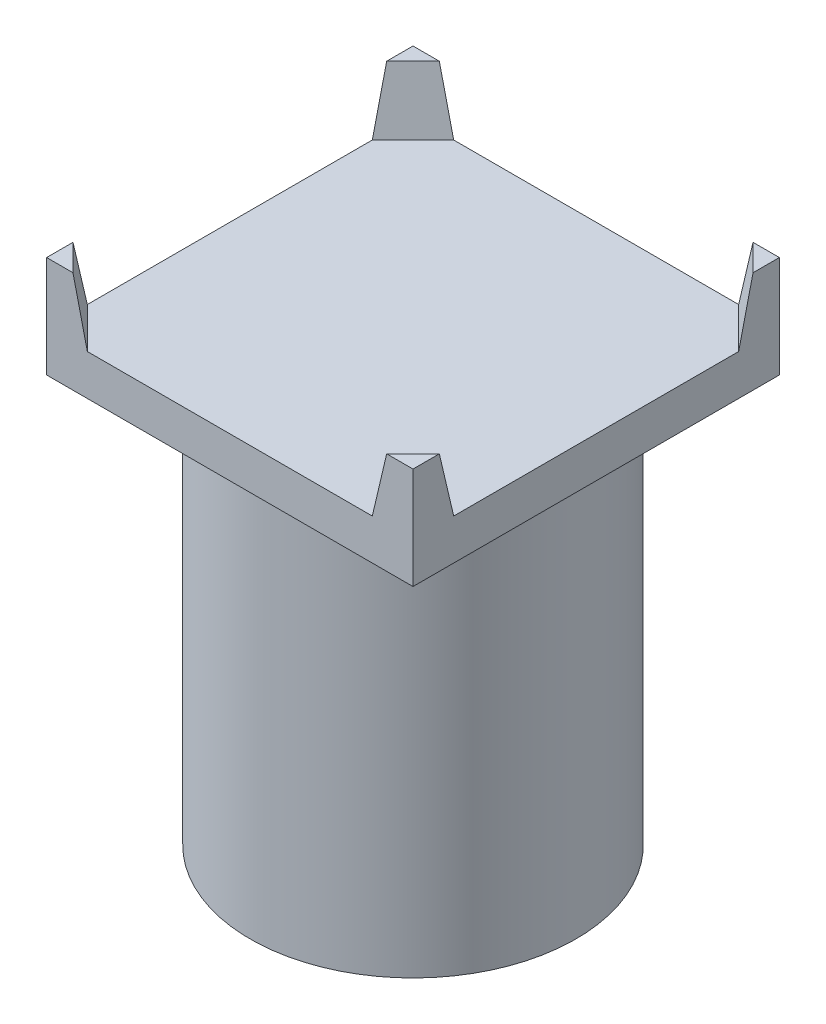
ISO-10303-21;
HEADER;
FILE_DESCRIPTION(('STEP AP214'),'2;1');
FILE_NAME('part.step','',(''),(''),'','','');
FILE_SCHEMA(('AUTOMOTIVE_DESIGN { 1 0 10303 214 1 1 1 1 }'));
ENDSEC;
DATA;
#1=APPLICATION_CONTEXT('core data for automotive mechanical design processes');
#2=APPLICATION_PROTOCOL_DEFINITION('international standard','automotive_design',2000,#1);
#3=PRODUCT_CONTEXT('',#1,'mechanical');
#4=PRODUCT('Part','Part','',(#3));
#5=PRODUCT_RELATED_PRODUCT_CATEGORY('part','',(#4));
#6=PRODUCT_DEFINITION_FORMATION('','',#4);
#7=PRODUCT_DEFINITION_CONTEXT('part definition',#1,'design');
#8=PRODUCT_DEFINITION('design','',#6,#7);
#9=PRODUCT_DEFINITION_SHAPE('','',#8);
#10=(LENGTH_UNIT() NAMED_UNIT(*) SI_UNIT(.MILLI.,.METRE.));
#11=(NAMED_UNIT(*) PLANE_ANGLE_UNIT() SI_UNIT($,.RADIAN.));
#12=(NAMED_UNIT(*) SI_UNIT($,.STERADIAN.) SOLID_ANGLE_UNIT());
#13=UNCERTAINTY_MEASURE_WITH_UNIT(LENGTH_MEASURE(1.E-05),#10,'distance_accuracy_value','');
#14=(GEOMETRIC_REPRESENTATION_CONTEXT(3) GLOBAL_UNCERTAINTY_ASSIGNED_CONTEXT((#13)) GLOBAL_UNIT_ASSIGNED_CONTEXT((#10,
#11,#12)) REPRESENTATION_CONTEXT('',''));
#15=CARTESIAN_POINT('',(0.,0.,0.));
#16=DIRECTION('',(0.,0.,1.));
#17=DIRECTION('',(1.,0.,0.));
#18=AXIS2_PLACEMENT_3D('',#15,#16,#17);
#19=CARTESIAN_POINT('',(-9.,2.,9.));
#20=DIRECTION('',(0.,0.,-1.));
#21=DIRECTION('',(-1.,0.,0.));
#22=AXIS2_PLACEMENT_3D('',#19,#20,#21);
#23=PLANE('',#22);
#24=DIRECTION('',(0.229415733870562,-0.973328526784575,0.));
#25=VECTOR('',#24,1.);
#26=CARTESIAN_POINT('',(-7.10526315789475,2.44659375653887,9.));
#27=LINE('',#26,#25);
#28=CARTESIAN_POINT('',(-7.70710678118655,5.,9.));
#29=VERTEX_POINT('',#28);
#30=CARTESIAN_POINT('',(-7.,2.,9.));
#31=VERTEX_POINT('',#30);
#32=EDGE_CURVE('E151',#29,#31,#27,.T.);
#33=ORIENTED_EDGE('',*,*,#32,.F.);
#34=DIRECTION('',(1.,0.,0.));
#35=VECTOR('',#34,1.);
#36=CARTESIAN_POINT('',(-9.,5.,9.));
#37=LINE('',#36,#35);
#38=CARTESIAN_POINT('',(-9.,5.,9.));
#39=VERTEX_POINT('',#38);
#40=EDGE_CURVE('E182',#39,#29,#37,.T.);
#41=ORIENTED_EDGE('',*,*,#40,.F.);
#42=DIRECTION('',(0.,-1.,0.));
#43=VECTOR('',#42,1.);
#44=CARTESIAN_POINT('',(-9.,2.,9.));
#45=LINE('',#44,#43);
#46=CARTESIAN_POINT('',(-9.,0.,9.));
#47=VERTEX_POINT('',#46);
#48=EDGE_CURVE('E186',#39,#47,#45,.T.);
#49=ORIENTED_EDGE('',*,*,#48,.T.);
#50=DIRECTION('',(1.,0.,0.));
#51=VECTOR('',#50,1.);
#52=CARTESIAN_POINT('',(-9.,0.,9.));
#53=LINE('',#52,#51);
#54=CARTESIAN_POINT('',(9.,0.,9.));
#55=VERTEX_POINT('',#54);
#56=EDGE_CURVE('E184',#47,#55,#53,.T.);
#57=ORIENTED_EDGE('',*,*,#56,.T.);
#58=DIRECTION('',(0.,-1.,0.));
#59=VECTOR('',#58,1.);
#60=CARTESIAN_POINT('',(9.,2.,9.));
#61=LINE('',#60,#59);
#62=CARTESIAN_POINT('',(9.,5.,9.));
#63=VERTEX_POINT('',#62);
#64=EDGE_CURVE('E175',#63,#55,#61,.T.);
#65=ORIENTED_EDGE('',*,*,#64,.F.);
#66=DIRECTION('',(1.,0.,0.));
#67=VECTOR('',#66,1.);
#68=CARTESIAN_POINT('',(9.,5.,9.));
#69=LINE('',#68,#67);
#70=CARTESIAN_POINT('',(7.70710678118656,5.,9.));
#71=VERTEX_POINT('',#70);
#72=EDGE_CURVE('E197',#71,#63,#69,.T.);
#73=ORIENTED_EDGE('',*,*,#72,.F.);
#74=DIRECTION('',(0.229415733870562,0.973328526784575,0.));
#75=VECTOR('',#74,1.);
#76=CARTESIAN_POINT('',(6.15789473684212,-1.57275005231098,9.));
#77=LINE('',#76,#75);
#78=CARTESIAN_POINT('',(7.,2.,9.));
#79=VERTEX_POINT('',#78);
#80=EDGE_CURVE('E149',#79,#71,#77,.T.);
#81=ORIENTED_EDGE('',*,*,#80,.F.);
#82=DIRECTION('',(1.,0.,0.));
#83=VECTOR('',#82,1.);
#84=CARTESIAN_POINT('',(-9.,2.,9.));
#85=LINE('',#84,#83);
#86=EDGE_CURVE('E142',#31,#79,#85,.T.);
#87=ORIENTED_EDGE('',*,*,#86,.F.);
#88=EDGE_LOOP('',(#33,#41,#49,#57,#65,#73,#81,#87));
#89=FACE_BOUND('',#88,.T.);
#90=ADVANCED_FACE('F32',(#89),#23,.F.);
#91=CARTESIAN_POINT('',(-9.,2.,-9.));
#92=DIRECTION('',(1.,0.,0.));
#93=DIRECTION('',(0.,0.,-1.));
#94=AXIS2_PLACEMENT_3D('',#91,#92,#93);
#95=PLANE('',#94);
#96=DIRECTION('',(0.,0.973328526784575,0.229415733870562));
#97=VECTOR('',#96,1.);
#98=CARTESIAN_POINT('',(-9.,-1.57275005231098,6.15789473684212));
#99=LINE('',#98,#97);
#100=CARTESIAN_POINT('',(-9.00000000000001,2.,7.));
#101=VERTEX_POINT('',#100);
#102=CARTESIAN_POINT('',(-9.,5.,7.70710678118656));
#103=VERTEX_POINT('',#102);
#104=EDGE_CURVE('E47',#101,#103,#99,.T.);
#105=ORIENTED_EDGE('',*,*,#104,.F.);
#106=DIRECTION('',(0.,0.,1.));
#107=VECTOR('',#106,1.);
#108=CARTESIAN_POINT('',(-9.,2.,-9.));
#109=LINE('',#108,#107);
#110=CARTESIAN_POINT('',(-9.00000000000001,2.,-7.));
#111=VERTEX_POINT('',#110);
#112=EDGE_CURVE('E167',#111,#101,#109,.T.);
#113=ORIENTED_EDGE('',*,*,#112,.F.);
#114=DIRECTION('',(0.,-0.973328526784575,0.229415733870562));
#115=VECTOR('',#114,1.);
#116=CARTESIAN_POINT('',(-9.,2.44659375653887,-7.10526315789475));
#117=LINE('',#116,#115);
#118=CARTESIAN_POINT('',(-9.00000000000001,5.,-7.70710678118655));
#119=VERTEX_POINT('',#118);
#120=EDGE_CURVE('E162',#119,#111,#117,.T.);
#121=ORIENTED_EDGE('',*,*,#120,.F.);
#122=DIRECTION('',(0.,0.,1.));
#123=VECTOR('',#122,1.);
#124=CARTESIAN_POINT('',(-9.,5.,-7.));
#125=LINE('',#124,#123);
#126=CARTESIAN_POINT('',(-9.,5.,-9.));
#127=VERTEX_POINT('',#126);
#128=EDGE_CURVE('E169',#127,#119,#125,.T.);
#129=ORIENTED_EDGE('',*,*,#128,.F.);
#130=DIRECTION('',(0.,-1.,0.));
#131=VECTOR('',#130,1.);
#132=CARTESIAN_POINT('',(-9.,2.,-9.));
#133=LINE('',#132,#131);
#134=CARTESIAN_POINT('',(-9.,0.,-9.));
#135=VERTEX_POINT('',#134);
#136=EDGE_CURVE('E183',#127,#135,#133,.T.);
#137=ORIENTED_EDGE('',*,*,#136,.T.);
#138=DIRECTION('',(0.,0.,1.));
#139=VECTOR('',#138,1.);
#140=CARTESIAN_POINT('',(-9.,0.,-9.));
#141=LINE('',#140,#139);
#142=EDGE_CURVE('E180',#135,#47,#141,.T.);
#143=ORIENTED_EDGE('',*,*,#142,.T.);
#144=ORIENTED_EDGE('',*,*,#48,.F.);
#145=DIRECTION('',(0.,0.,1.));
#146=VECTOR('',#145,1.);
#147=CARTESIAN_POINT('',(-9.,5.,7.));
#148=LINE('',#147,#146);
#149=EDGE_CURVE('E189',#103,#39,#148,.T.);
#150=ORIENTED_EDGE('',*,*,#149,.F.);
#151=EDGE_LOOP('',(#105,#113,#121,#129,#137,#143,#144,#150));
#152=FACE_BOUND('',#151,.T.);
#153=ADVANCED_FACE('F34',(#152),#95,.F.);
#154=CARTESIAN_POINT('',(0.,5.,0.));
#155=DIRECTION('',(0.,1.,0.));
#156=DIRECTION('',(0.,0.,1.));
#157=AXIS2_PLACEMENT_3D('',#154,#155,#156);
#158=PLANE('',#157);
#159=ORIENTED_EDGE('',*,*,#40,.T.);
#160=DIRECTION('',(-0.707106781186548,0.,-0.707106781186548));
#161=VECTOR('',#160,1.);
#162=CARTESIAN_POINT('',(-7.70710678118655,5.,9.));
#163=LINE('',#162,#161);
#164=EDGE_CURVE('E208',#29,#103,#163,.T.);
#165=ORIENTED_EDGE('',*,*,#164,.T.);
#166=ORIENTED_EDGE('',*,*,#149,.T.);
#167=EDGE_LOOP('',(#159,#165,#166));
#168=FACE_BOUND('',#167,.T.);
#169=ADVANCED_FACE('F214',(#168),#158,.T.);
#170=CARTESIAN_POINT('',(9.,2.,-9.));
#171=DIRECTION('',(-1.,0.,0.));
#172=DIRECTION('',(0.,0.,1.));
#173=AXIS2_PLACEMENT_3D('',#170,#171,#172);
#174=PLANE('',#173);
#175=DIRECTION('',(0.,-0.973328526784575,-0.229415733870562));
#176=VECTOR('',#175,1.);
#177=CARTESIAN_POINT('',(9.,-1.57275005231098,6.15789473684212));
#178=LINE('',#177,#176);
#179=CARTESIAN_POINT('',(9.00000000000001,5.,7.70710678118655));
#180=VERTEX_POINT('',#179);
#181=CARTESIAN_POINT('',(9.00000000000001,2.,7.));
#182=VERTEX_POINT('',#181);
#183=EDGE_CURVE('E121',#180,#182,#178,.T.);
#184=ORIENTED_EDGE('',*,*,#183,.F.);
#185=DIRECTION('',(0.,0.,-1.));
#186=VECTOR('',#185,1.);
#187=CARTESIAN_POINT('',(9.,5.,7.));
#188=LINE('',#187,#186);
#189=EDGE_CURVE('E174',#63,#180,#188,.T.);
#190=ORIENTED_EDGE('',*,*,#189,.F.);
#191=ORIENTED_EDGE('',*,*,#64,.T.);
#192=DIRECTION('',(0.,0.,-1.));
#193=VECTOR('',#192,1.);
#194=CARTESIAN_POINT('',(9.,0.,-9.));
#195=LINE('',#194,#193);
#196=CARTESIAN_POINT('',(9.,0.,-9.));
#197=VERTEX_POINT('',#196);
#198=EDGE_CURVE('E171',#55,#197,#195,.T.);
#199=ORIENTED_EDGE('',*,*,#198,.T.);
#200=DIRECTION('',(0.,-1.,0.));
#201=VECTOR('',#200,1.);
#202=CARTESIAN_POINT('',(9.,2.,-9.));
#203=LINE('',#202,#201);
#204=CARTESIAN_POINT('',(9.,5.,-9.));
#205=VERTEX_POINT('',#204);
#206=EDGE_CURVE('E179',#205,#197,#203,.T.);
#207=ORIENTED_EDGE('',*,*,#206,.F.);
#208=DIRECTION('',(0.,0.,-1.));
#209=VECTOR('',#208,1.);
#210=CARTESIAN_POINT('',(9.,5.,-7.));
#211=LINE('',#210,#209);
#212=CARTESIAN_POINT('',(9.,5.,-7.70710678118656));
#213=VERTEX_POINT('',#212);
#214=EDGE_CURVE('E203',#213,#205,#211,.T.);
#215=ORIENTED_EDGE('',*,*,#214,.F.);
#216=DIRECTION('',(0.,0.973328526784575,-0.229415733870562));
#217=VECTOR('',#216,1.);
#218=CARTESIAN_POINT('',(9.,2.44659375653887,-7.10526315789475));
#219=LINE('',#218,#217);
#220=CARTESIAN_POINT('',(9.00000000000001,2.,-7.));
#221=VERTEX_POINT('',#220);
#222=EDGE_CURVE('E138',#221,#213,#219,.T.);
#223=ORIENTED_EDGE('',*,*,#222,.F.);
#224=DIRECTION('',(0.,0.,-1.));
#225=VECTOR('',#224,1.);
#226=CARTESIAN_POINT('',(9.,2.,-9.));
#227=LINE('',#226,#225);
#228=EDGE_CURVE('E135',#182,#221,#227,.T.);
#229=ORIENTED_EDGE('',*,*,#228,.F.);
#230=EDGE_LOOP('',(#184,#190,#191,#199,#207,#215,#223,#229));
#231=FACE_BOUND('',#230,.T.);
#232=ADVANCED_FACE('F136',(#231),#174,.F.);
#233=CARTESIAN_POINT('',(0.,5.,0.));
#234=DIRECTION('',(0.,1.,0.));
#235=DIRECTION('',(0.,0.,1.));
#236=AXIS2_PLACEMENT_3D('',#233,#234,#235);
#237=PLANE('',#236);
#238=ORIENTED_EDGE('',*,*,#189,.T.);
#239=DIRECTION('',(0.707106781186548,0.,-0.707106781186548));
#240=VECTOR('',#239,1.);
#241=CARTESIAN_POINT('',(7.70710678118655,5.,9.));
#242=LINE('',#241,#240);
#243=EDGE_CURVE('E128',#71,#180,#242,.T.);
#244=ORIENTED_EDGE('',*,*,#243,.F.);
#245=ORIENTED_EDGE('',*,*,#72,.T.);
#246=EDGE_LOOP('',(#238,#244,#245));
#247=FACE_BOUND('',#246,.T.);
#248=ADVANCED_FACE('F255',(#247),#237,.T.);
#249=CARTESIAN_POINT('',(-9.,2.,-9.));
#250=DIRECTION('',(0.,0.,1.));
#251=DIRECTION('',(1.,0.,0.));
#252=AXIS2_PLACEMENT_3D('',#249,#250,#251);
#253=PLANE('',#252);
#254=DIRECTION('',(-0.229415733870562,-0.973328526784575,0.));
#255=VECTOR('',#254,1.);
#256=CARTESIAN_POINT('',(6.15789473684212,-1.57275005231098,-9.));
#257=LINE('',#256,#255);
#258=CARTESIAN_POINT('',(7.70710678118655,5.,-9.));
#259=VERTEX_POINT('',#258);
#260=CARTESIAN_POINT('',(7.,2.,-9.));
#261=VERTEX_POINT('',#260);
#262=EDGE_CURVE('E159',#259,#261,#257,.T.);
#263=ORIENTED_EDGE('',*,*,#262,.F.);
#264=DIRECTION('',(-1.,0.,0.));
#265=VECTOR('',#264,1.);
#266=CARTESIAN_POINT('',(9.,5.,-9.));
#267=LINE('',#266,#265);
#268=EDGE_CURVE('E178',#205,#259,#267,.T.);
#269=ORIENTED_EDGE('',*,*,#268,.F.);
#270=ORIENTED_EDGE('',*,*,#206,.T.);
#271=DIRECTION('',(-1.,0.,0.));
#272=VECTOR('',#271,1.);
#273=CARTESIAN_POINT('',(-9.,0.,-9.));
#274=LINE('',#273,#272);
#275=EDGE_CURVE('E176',#197,#135,#274,.T.);
#276=ORIENTED_EDGE('',*,*,#275,.T.);
#277=ORIENTED_EDGE('',*,*,#136,.F.);
#278=DIRECTION('',(-1.,0.,0.));
#279=VECTOR('',#278,1.);
#280=CARTESIAN_POINT('',(-9.,5.,-9.));
#281=LINE('',#280,#279);
#282=CARTESIAN_POINT('',(-7.70710678118656,5.,-9.));
#283=VERTEX_POINT('',#282);
#284=EDGE_CURVE('E206',#283,#127,#281,.T.);
#285=ORIENTED_EDGE('',*,*,#284,.F.);
#286=DIRECTION('',(-0.229415733870562,0.973328526784575,0.));
#287=VECTOR('',#286,1.);
#288=CARTESIAN_POINT('',(-7.10526315789475,2.44659375653887,-9.));
#289=LINE('',#288,#287);
#290=CARTESIAN_POINT('',(-7.,2.,-9.));
#291=VERTEX_POINT('',#290);
#292=EDGE_CURVE('E161',#291,#283,#289,.T.);
#293=ORIENTED_EDGE('',*,*,#292,.F.);
#294=DIRECTION('',(-1.,0.,0.));
#295=VECTOR('',#294,1.);
#296=CARTESIAN_POINT('',(-9.,2.,-9.));
#297=LINE('',#296,#295);
#298=EDGE_CURVE('E141',#261,#291,#297,.T.);
#299=ORIENTED_EDGE('',*,*,#298,.F.);
#300=EDGE_LOOP('',(#263,#269,#270,#276,#277,#285,#293,#299));
#301=FACE_BOUND('',#300,.T.);
#302=ADVANCED_FACE('F247',(#301),#253,.F.);
#303=CARTESIAN_POINT('',(0.,5.,0.));
#304=DIRECTION('',(0.,1.,0.));
#305=DIRECTION('',(0.,0.,1.));
#306=AXIS2_PLACEMENT_3D('',#303,#304,#305);
#307=PLANE('',#306);
#308=ORIENTED_EDGE('',*,*,#268,.T.);
#309=DIRECTION('',(0.707106781186548,0.,0.707106781186548));
#310=VECTOR('',#309,1.);
#311=CARTESIAN_POINT('',(7.70710678118655,5.,-9.));
#312=LINE('',#311,#310);
#313=EDGE_CURVE('E200',#259,#213,#312,.T.);
#314=ORIENTED_EDGE('',*,*,#313,.T.);
#315=ORIENTED_EDGE('',*,*,#214,.T.);
#316=EDGE_LOOP('',(#308,#314,#315));
#317=FACE_BOUND('',#316,.T.);
#318=ADVANCED_FACE('F262',(#317),#307,.T.);
#319=CARTESIAN_POINT('',(0.,5.,0.));
#320=DIRECTION('',(0.,-1.,0.));
#321=DIRECTION('',(0.,0.,-1.));
#322=AXIS2_PLACEMENT_3D('',#319,#320,#321);
#323=PLANE('',#322);
#324=DIRECTION('',(-0.707106781186548,0.,0.707106781186548));
#325=VECTOR('',#324,1.);
#326=CARTESIAN_POINT('',(-7.70710678118655,5.,-9.));
#327=LINE('',#326,#325);
#328=EDGE_CURVE('E166',#283,#119,#327,.T.);
#329=ORIENTED_EDGE('',*,*,#328,.F.);
#330=ORIENTED_EDGE('',*,*,#284,.T.);
#331=ORIENTED_EDGE('',*,*,#128,.T.);
#332=EDGE_LOOP('',(#329,#330,#331));
#333=FACE_BOUND('',#332,.T.);
#334=ADVANCED_FACE('F243',(#333),#323,.F.);
#335=CARTESIAN_POINT('',(0.,2.,0.));
#336=DIRECTION('',(0.,1.,0.));
#337=DIRECTION('',(0.,0.,1.));
#338=AXIS2_PLACEMENT_3D('',#335,#336,#337);
#339=PLANE('',#338);
#340=ORIENTED_EDGE('',*,*,#112,.T.);
#341=DIRECTION('',(-0.707106781186548,0.,-0.707106781186548));
#342=VECTOR('',#341,1.);
#343=CARTESIAN_POINT('',(-7.,2.,9.));
#344=LINE('',#343,#342);
#345=EDGE_CURVE('E155',#31,#101,#344,.T.);
#346=ORIENTED_EDGE('',*,*,#345,.F.);
#347=ORIENTED_EDGE('',*,*,#86,.T.);
#348=DIRECTION('',(-0.707106781186548,0.,0.707106781186548));
#349=VECTOR('',#348,1.);
#350=CARTESIAN_POINT('',(7.,2.,9.));
#351=LINE('',#350,#349);
#352=EDGE_CURVE('E125',#182,#79,#351,.T.);
#353=ORIENTED_EDGE('',*,*,#352,.F.);
#354=ORIENTED_EDGE('',*,*,#228,.T.);
#355=DIRECTION('',(0.707106781186548,0.,0.707106781186548));
#356=VECTOR('',#355,1.);
#357=CARTESIAN_POINT('',(7.,2.,-9.));
#358=LINE('',#357,#356);
#359=EDGE_CURVE('E157',#261,#221,#358,.T.);
#360=ORIENTED_EDGE('',*,*,#359,.F.);
#361=ORIENTED_EDGE('',*,*,#298,.T.);
#362=DIRECTION('',(0.707106781186548,0.,-0.707106781186548));
#363=VECTOR('',#362,1.);
#364=CARTESIAN_POINT('',(-7.,2.,-9.));
#365=LINE('',#364,#363);
#366=EDGE_CURVE('E160',#111,#291,#365,.T.);
#367=ORIENTED_EDGE('',*,*,#366,.F.);
#368=EDGE_LOOP('',(#340,#346,#347,#353,#354,#360,#361,#367));
#369=FACE_BOUND('',#368,.T.);
#370=ADVANCED_FACE('F146',(#369),#339,.T.);
#371=CARTESIAN_POINT('',(0.,0.,0.));
#372=DIRECTION('',(0.,1.,0.));
#373=DIRECTION('',(0.,0.,1.));
#374=AXIS2_PLACEMENT_3D('',#371,#372,#373);
#375=PLANE('',#374);
#376=CARTESIAN_POINT('',(0.,0.,0.));
#377=DIRECTION('',(0.,-1.,0.));
#378=DIRECTION('',(0.,0.,-1.));
#379=AXIS2_PLACEMENT_3D('',#376,#377,#378);
#380=CIRCLE('',#379,8.);
#381=CARTESIAN_POINT('',(0.,0.,-8.));
#382=VERTEX_POINT('',#381);
#383=EDGE_CURVE('E11',#382,#382,#380,.T.);
#384=ORIENTED_EDGE('',*,*,#383,.F.);
#385=EDGE_LOOP('',(#384));
#386=FACE_BOUND('',#385,.T.);
#387=ORIENTED_EDGE('',*,*,#198,.F.);
#388=ORIENTED_EDGE('',*,*,#56,.F.);
#389=ORIENTED_EDGE('',*,*,#142,.F.);
#390=ORIENTED_EDGE('',*,*,#275,.F.);
#391=EDGE_LOOP('',(#387,#388,#389,#390));
#392=FACE_BOUND('',#391,.T.);
#393=ADVANCED_FACE('F250',(#386,#392),#375,.F.);
#394=CARTESIAN_POINT('',(-7.55445185475032,-1.78060137821375,-7.55445185475032));
#395=DIRECTION('',(0.697485832462916,0.164398987305358,0.697485832462916));
#396=DIRECTION('',(0.707106781186547,0.,-0.707106781186547));
#397=AXIS2_PLACEMENT_3D('',#394,#395,#396);
#398=PLANE('',#397);
#399=ORIENTED_EDGE('',*,*,#328,.T.);
#400=ORIENTED_EDGE('',*,*,#120,.T.);
#401=ORIENTED_EDGE('',*,*,#366,.T.);
#402=ORIENTED_EDGE('',*,*,#292,.T.);
#403=EDGE_LOOP('',(#399,#400,#401,#402));
#404=FACE_BOUND('',#403,.T.);
#405=ADVANCED_FACE('F236',(#404),#398,.T.);
#406=CARTESIAN_POINT('',(7.55445185475032,-1.78060137821375,-7.55445185475032));
#407=DIRECTION('',(-0.697485832462916,0.164398987305358,0.697485832462916));
#408=DIRECTION('',(-0.707106781186547,0.,-0.707106781186547));
#409=AXIS2_PLACEMENT_3D('',#406,#407,#408);
#410=PLANE('',#409);
#411=ORIENTED_EDGE('',*,*,#313,.F.);
#412=ORIENTED_EDGE('',*,*,#262,.T.);
#413=ORIENTED_EDGE('',*,*,#359,.T.);
#414=ORIENTED_EDGE('',*,*,#222,.T.);
#415=EDGE_LOOP('',(#411,#412,#413,#414));
#416=FACE_BOUND('',#415,.T.);
#417=ADVANCED_FACE('F332',(#416),#410,.T.);
#418=CARTESIAN_POINT('',(7.55445185475032,-1.78060137821375,7.55445185475032));
#419=DIRECTION('',(-0.697485832462916,0.164398987305358,-0.697485832462916));
#420=DIRECTION('',(-0.707106781186547,0.,0.707106781186547));
#421=AXIS2_PLACEMENT_3D('',#418,#419,#420);
#422=PLANE('',#421);
#423=ORIENTED_EDGE('',*,*,#243,.T.);
#424=ORIENTED_EDGE('',*,*,#183,.T.);
#425=ORIENTED_EDGE('',*,*,#352,.T.);
#426=ORIENTED_EDGE('',*,*,#80,.T.);
#427=EDGE_LOOP('',(#423,#424,#425,#426));
#428=FACE_BOUND('',#427,.T.);
#429=ADVANCED_FACE('F123',(#428),#422,.T.);
#430=CARTESIAN_POINT('',(-7.55445185475032,-1.78060137821375,7.55445185475032));
#431=DIRECTION('',(0.697485832462916,0.164398987305358,-0.697485832462916));
#432=DIRECTION('',(0.707106781186547,0.,0.707106781186547));
#433=AXIS2_PLACEMENT_3D('',#430,#431,#432);
#434=PLANE('',#433);
#435=ORIENTED_EDGE('',*,*,#164,.F.);
#436=ORIENTED_EDGE('',*,*,#32,.T.);
#437=ORIENTED_EDGE('',*,*,#345,.T.);
#438=ORIENTED_EDGE('',*,*,#104,.T.);
#439=EDGE_LOOP('',(#435,#436,#437,#438));
#440=FACE_BOUND('',#439,.T.);
#441=ADVANCED_FACE('F272',(#440),#434,.T.);
#442=CARTESIAN_POINT('',(0.,-20.,0.));
#443=DIRECTION('',(0.,1.,0.));
#444=DIRECTION('',(0.,0.,1.));
#445=AXIS2_PLACEMENT_3D('',#442,#443,#444);
#446=CYLINDRICAL_SURFACE('',#445,8.);
#447=CARTESIAN_POINT('',(1.5,-10.,-7.85811682275086));
#448=CARTESIAN_POINT('',(1.49999679883246,-9.91654279198826,-7.85811843793494));
#449=CARTESIAN_POINT('',(1.49301126348936,-9.83304405178161,-7.85946079760266));
#450=CARTESIAN_POINT('',(1.46527253251805,-9.66840103841809,-7.86467851014364));
#451=CARTESIAN_POINT('',(1.44450765768477,-9.58725882357252,-7.86855601173205));
#452=CARTESIAN_POINT('',(1.38987035617788,-9.42973492862913,-7.87838976464885));
#453=CARTESIAN_POINT('',(1.35601013954374,-9.35334889069271,-7.88434407905997));
#454=CARTESIAN_POINT('',(1.27617565760366,-9.20734644071319,-7.89765826320959));
#455=CARTESIAN_POINT('',(1.23020233759193,-9.1377295009967,-7.90501802325622));
#456=CARTESIAN_POINT('',(1.12683678942622,-9.00636980080087,-7.92041614838944));
#457=CARTESIAN_POINT('',(1.06932292933092,-8.94472351652827,-7.92846116625679));
#458=CARTESIAN_POINT('',(0.944771778803552,-8.83189561040044,-7.94426457664034));
#459=CARTESIAN_POINT('',(0.877733863624945,-8.78071467557521,-7.95202295031153));
#460=CARTESIAN_POINT('',(0.735403894570163,-8.68990062339948,-7.96645017828405));
#461=CARTESIAN_POINT('',(0.660052840033866,-8.65035846648058,-7.97311028052363));
#462=CARTESIAN_POINT('',(0.503631283250763,-8.58453045772647,-7.98451608632931));
#463=CARTESIAN_POINT('',(0.422561251859506,-8.55824351600978,-7.98926194728334));
#464=CARTESIAN_POINT('',(0.258002746187416,-8.51997045138887,-7.99625755123778));
#465=CARTESIAN_POINT('',(0.174553323244857,-8.50782169407731,-7.99853565976327));
#466=CARTESIAN_POINT('',(0.00677167603538302,-8.4976631122996,-8.00043684615594));
#467=CARTESIAN_POINT('',(-0.0775604724476701,-8.49965208386094,-8.00006015010697));
#468=CARTESIAN_POINT('',(-0.243598357899396,-8.51758777114715,-7.99671633763241));
#469=CARTESIAN_POINT('',(-0.325323760451469,-8.53335936943001,-7.99378172247214));
#470=CARTESIAN_POINT('',(-0.484947165715475,-8.57813564939524,-7.98568826333561));
#471=CARTESIAN_POINT('',(-0.56284502882654,-8.6071408133458,-7.98052933829966));
#472=CARTESIAN_POINT('',(-0.71311006575152,-8.6777277310583,-7.96851260297339));
#473=CARTESIAN_POINT('',(-0.785443571838532,-8.7193794879125,-7.96164537590825));
#474=CARTESIAN_POINT('',(-0.922159977214637,-8.81402566907715,-7.9469714754285));
#475=CARTESIAN_POINT('',(-0.986542066910784,-8.86702124688758,-7.93916470651164));
#476=CARTESIAN_POINT('',(-1.10656561896904,-8.98381570298353,-7.92333513680567));
#477=CARTESIAN_POINT('',(-1.16205790757041,-9.04776778390208,-7.91531085901621));
#478=CARTESIAN_POINT('',(-1.2615517185126,-9.18414953127862,-7.90006508924621));
#479=CARTESIAN_POINT('',(-1.30555307271182,-9.25657932176463,-7.89284360901351));
#480=CARTESIAN_POINT('',(-1.38085852224478,-9.40805827070266,-7.88001893307121));
#481=CARTESIAN_POINT('',(-1.41214093645421,-9.48711845719064,-7.87441850530261));
#482=CARTESIAN_POINT('',(-1.46093656975056,-9.6495011841232,-7.86551242396689));
#483=CARTESIAN_POINT('',(-1.47845134901108,-9.73282324046479,-7.8622065103862));
#484=CARTESIAN_POINT('',(-1.49899672649739,-9.90001932885588,-7.85831520301005));
#485=CARTESIAN_POINT('',(-1.50224164285859,-9.98386611556552,-7.85768955816137));
#486=CARTESIAN_POINT('',(-1.49472968881724,-10.1509034550871,-7.8591219142084));
#487=CARTESIAN_POINT('',(-1.48397351086433,-10.2340940401481,-7.86117978238611));
#488=CARTESIAN_POINT('',(-1.44894868195883,-10.3967529030544,-7.86770980063205));
#489=CARTESIAN_POINT('',(-1.4247923858399,-10.4762462526249,-7.87216186690878));
#490=CARTESIAN_POINT('',(-1.3637722437906,-10.6300571897302,-7.88296134156619));
#491=CARTESIAN_POINT('',(-1.32690746128795,-10.7043743953153,-7.88930888963281));
#492=CARTESIAN_POINT('',(-1.2410235311966,-10.8466676190432,-7.90327577863685));
#493=CARTESIAN_POINT('',(-1.19186899639621,-10.9145605378661,-7.91090895425315));
#494=CARTESIAN_POINT('',(-1.08298344344247,-11.0412120402143,-7.926548113681));
#495=CARTESIAN_POINT('',(-1.02325147433084,-11.0999698015558,-7.93455413096494));
#496=CARTESIAN_POINT('',(-0.893949417870386,-11.2074837635341,-7.95016624005946));
#497=CARTESIAN_POINT('',(-0.824258534095891,-11.256095826606,-7.95776555833305));
#498=CARTESIAN_POINT('',(-0.677574523040141,-11.3409212061777,-7.97159404810351));
#499=CARTESIAN_POINT('',(-0.600581677038529,-11.377135000025,-7.97782327234725));
#500=CARTESIAN_POINT('',(-0.441877541578685,-11.4359200978641,-7.98818057995848));
#501=CARTESIAN_POINT('',(-0.360193213078989,-11.4585621875614,-7.99231954730142));
#502=CARTESIAN_POINT('',(-0.194096227381571,-11.4897870482899,-7.99807642083745));
#503=CARTESIAN_POINT('',(-0.109683858215851,-11.4983712986627,-7.99969459229933));
#504=CARTESIAN_POINT('',(0.0580907602505088,-11.5011853015184,-8.00022227515441));
#505=CARTESIAN_POINT('',(0.141449307066268,-11.4956327531295,-7.99917286625032));
#506=CARTESIAN_POINT('',(0.306023369279199,-11.4708075722316,-7.99456866611703));
#507=CARTESIAN_POINT('',(0.387238905213689,-11.4515350712558,-7.99101389890671));
#508=CARTESIAN_POINT('',(0.545106475595484,-11.3999087926163,-7.98179837978045));
#509=CARTESIAN_POINT('',(0.621766319318224,-11.367578187119,-7.97614135981576));
#510=CARTESIAN_POINT('',(0.768605631316694,-11.2907795463448,-7.96333372068771));
#511=CARTESIAN_POINT('',(0.83878466500327,-11.2463106978933,-7.95618300146483));
#512=CARTESIAN_POINT('',(0.971755027780005,-11.1457485455577,-7.94104779859941));
#513=CARTESIAN_POINT('',(1.03442623539053,-11.0894979661383,-7.93305284591272));
#514=CARTESIAN_POINT('',(1.14951536065485,-10.9672954375073,-7.91719633538833));
#515=CARTESIAN_POINT('',(1.2019308632478,-10.9013412096263,-7.90933480936765));
#516=CARTESIAN_POINT('',(1.29547633945385,-10.7608735452967,-7.89455577425926));
#517=CARTESIAN_POINT('',(1.33649740531872,-10.6862865603324,-7.88764767280729));
#518=CARTESIAN_POINT('',(1.40536132423416,-10.5311742100203,-7.87567084650033));
#519=CARTESIAN_POINT('',(1.43321661638912,-10.4506545334106,-7.87060038649116));
#520=CARTESIAN_POINT('',(1.46929726596175,-10.3082477119341,-7.86393016292125));
#521=CARTESIAN_POINT('',(1.4807910573985,-10.2471942762381,-7.86176310717932));
#522=CARTESIAN_POINT('',(1.49614351076215,-10.1241015315797,-7.85885585595504));
#523=CARTESIAN_POINT('',(1.50000238052127,-10.0620622494997,-7.85811562163282));
#524=CARTESIAN_POINT('',(1.5,-10.,-7.85811682275086));
#525=B_SPLINE_CURVE_WITH_KNOTS('',3,(#447,#448,#449,#450,#451,#452,#453,#454,#455,#456,#457,
#458,#459,#460,#461,#462,#463,#464,#465,#466,#467,#468,#469,#470,#471,#472,#473,#474,#475,#476,
#477,#478,#479,#480,#481,#482,#483,#484,#485,#486,#487,#488,#489,#490,#491,#492,#493,#494,#495,
#496,#497,#498,#499,#500,#501,#502,#503,#504,#505,#506,#507,#508,#509,#510,#511,#512,#513,#514,
#515,#516,#517,#518,#519,#520,#521,#522,#523,#524),.UNSPECIFIED.,.T.,.F.,(4,2,2,2,2,2,2,2,2,2,2,
2,2,2,2,2,2,2,2,2,2,2,2,2,2,2,2,2,2,2,2,2,2,2,2,2,2,2,4),(0.,0.250144505793185,
0.500501302380392,0.750625227978431,1.00072963993908,1.25362335698691,1.50653367069315,
1.76137104348047,2.0161874593964,2.26804275460261,2.51987660200648,2.76855650598725,
3.01724547328424,3.26733691984219,3.51745380911785,3.77140614764064,4.025362201924,
4.27974936118266,4.53410768866487,4.78463248587075,5.03514489338718,5.28358792315369,
5.53204926624317,5.78337862654143,6.03473059394677,6.2894412549587,6.54414210821705,
6.79750269418683,7.0508366166733,7.30029300570138,7.54974700322167,7.79876026530358,
8.0477902135711,8.30038464008744,8.55303847730765,8.80803001818118,9.06278015749119,
9.24880307527215,9.43482092920425),.UNSPECIFIED.);
#526=CARTESIAN_POINT('',(1.5,-10.,-7.85811682275086));
#527=VERTEX_POINT('',#526);
#528=EDGE_CURVE('E419',#527,#527,#525,.T.);
#529=ORIENTED_EDGE('',*,*,#528,.T.);
#530=EDGE_LOOP('',(#529));
#531=FACE_BOUND('',#530,.T.);
#532=CARTESIAN_POINT('',(0.,-20.,0.));
#533=DIRECTION('',(0.,-1.,0.));
#534=DIRECTION('',(0.,0.,-1.));
#535=AXIS2_PLACEMENT_3D('',#532,#533,#534);
#536=CIRCLE('',#535,8.);
#537=CARTESIAN_POINT('',(0.,-20.,-8.));
#538=VERTEX_POINT('',#537);
#539=EDGE_CURVE('E192',#538,#538,#536,.T.);
#540=ORIENTED_EDGE('',*,*,#539,.F.);
#541=EDGE_LOOP('',(#540));
#542=FACE_BOUND('',#541,.T.);
#543=ORIENTED_EDGE('',*,*,#383,.T.);
#544=EDGE_LOOP('',(#543));
#545=FACE_BOUND('',#544,.T.);
#546=ADVANCED_FACE('F358',(#531,#542,#545),#446,.T.);
#547=CARTESIAN_POINT('',(0.,-20.,0.));
#548=DIRECTION('',(0.,-1.,0.));
#549=DIRECTION('',(0.,0.,-1.));
#550=AXIS2_PLACEMENT_3D('',#547,#548,#549);
#551=PLANE('',#550);
#552=CARTESIAN_POINT('',(0.,-20.,0.));
#553=DIRECTION('',(0.,-1.,0.));
#554=DIRECTION('',(0.,0.,-1.));
#555=AXIS2_PLACEMENT_3D('',#552,#553,#554);
#556=CIRCLE('',#555,2.5);
#557=CARTESIAN_POINT('',(0.,-20.,-2.5));
#558=VERTEX_POINT('',#557);
#559=EDGE_CURVE('E425',#558,#558,#556,.T.);
#560=ORIENTED_EDGE('',*,*,#559,.F.);
#561=EDGE_LOOP('',(#560));
#562=FACE_BOUND('',#561,.T.);
#563=ORIENTED_EDGE('',*,*,#539,.T.);
#564=EDGE_LOOP('',(#563));
#565=FACE_BOUND('',#564,.T.);
#566=ADVANCED_FACE('F371',(#562,#565),#551,.T.);
#567=CARTESIAN_POINT('',(0.,0.,0.));
#568=DIRECTION('',(0.,-1.,0.));
#569=DIRECTION('',(0.,0.,-1.));
#570=AXIS2_PLACEMENT_3D('',#567,#568,#569);
#571=CYLINDRICAL_SURFACE('',#570,2.5);
#572=CARTESIAN_POINT('',(0.,-8.5,-2.5));
#573=CARTESIAN_POINT('',(0.0767298334620158,-8.50000409100988,-2.49999625789732));
#574=CARTESIAN_POINT('',(0.153582320644178,-8.50592867092626,-2.4964290461501));
#575=CARTESIAN_POINT('',(0.304975509530679,-8.52932431951533,-2.48249903608568));
#576=CARTESIAN_POINT('',(0.379510034596047,-8.54682386185423,-2.47211948032719));
#577=CARTESIAN_POINT('',(0.523751827790836,-8.59238636116686,-2.44561558054488));
#578=CARTESIAN_POINT('',(0.593481028226565,-8.62039695816316,-2.42951973272944));
#579=CARTESIAN_POINT('',(0.727030318214658,-8.68586033314103,-2.39295367626407));
#580=CARTESIAN_POINT('',(0.790851869416382,-8.72331076696875,-2.37248455380255));
#581=CARTESIAN_POINT('',(0.916299278999314,-8.80977482670858,-2.32705360719088));
#582=CARTESIAN_POINT('',(0.977384020081414,-8.85945369535139,-2.30186792195985));
#583=CARTESIAN_POINT('',(1.09088270411891,-8.96746720382827,-2.25030439279634));
#584=CARTESIAN_POINT('',(1.14328534948112,-9.02581293718732,-2.22392505153571));
#585=CARTESIAN_POINT('',(1.24444996762974,-9.15792351049673,-2.1691106699591));
#586=CARTESIAN_POINT('',(1.29197766378809,-9.23270177098129,-2.14082017703649));
#587=CARTESIAN_POINT('',(1.37361437764896,-9.39084657324311,-2.08938301412124));
#588=CARTESIAN_POINT('',(1.4077451733516,-9.47419889624757,-2.06622802273938));
#589=CARTESIAN_POINT('',(1.45440601714222,-9.62659645065324,-2.0335462966093));
#590=CARTESIAN_POINT('',(1.47016197246826,-9.69423599861032,-2.02207883137591));
#591=CARTESIAN_POINT('',(1.49216172340475,-9.83180371583036,-2.00590308295503));
#592=CARTESIAN_POINT('',(1.49841734556836,-9.90172892875449,-2.0011863964376));
#593=CARTESIAN_POINT('',(1.50105508796009,-10.0420114942173,-1.99920922463856));
#594=CARTESIAN_POINT('',(1.49741783408419,-10.1123694250932,-2.00196337012718));
#595=CARTESIAN_POINT('',(1.48046060478828,-10.2512787754276,-2.01453261443741));
#596=CARTESIAN_POINT('',(1.46713334620103,-10.3198287958474,-2.02435302432226));
#597=CARTESIAN_POINT('',(1.43173921881792,-10.4525302421281,-2.04953186944258));
#598=CARTESIAN_POINT('',(1.40978748666087,-10.5167270539245,-2.06481711652537));
#599=CARTESIAN_POINT('',(1.35795061770837,-10.6406949909281,-2.09927051350828));
#600=CARTESIAN_POINT('',(1.32806257259705,-10.7004644834239,-2.11844008623465));
#601=CARTESIAN_POINT('',(1.25517983184583,-10.8249840971228,-2.16255327268985));
#602=CARTESIAN_POINT('',(1.21080724397723,-10.8887780929549,-2.18792043372992));
#603=CARTESIAN_POINT('',(1.11291092784003,-11.008676483667,-2.23930599764381));
#604=CARTESIAN_POINT('',(1.05937845100578,-11.0647734339765,-2.26532500262149));
#605=CARTESIAN_POINT('',(0.935811834382964,-11.1756129818218,-2.31935504958317));
#606=CARTESIAN_POINT('',(0.864517682704955,-11.229077306016,-2.34713836268532));
#607=CARTESIAN_POINT('',(0.712276050458998,-11.3231220471979,-2.39772428433981));
#608=CARTESIAN_POINT('',(0.631333763943562,-11.36370935379,-2.42052955425515));
#609=CARTESIAN_POINT('',(0.467197585268204,-11.4279321827959,-2.45730392066151));
#610=CARTESIAN_POINT('',(0.384467624173578,-11.4524753557159,-2.47173957439704));
#611=CARTESIAN_POINT('',(0.215047895144638,-11.4870111974054,-2.49218842813551));
#612=CARTESIAN_POINT('',(0.128363005661318,-11.4970213177536,-2.49821172952738));
#613=CARTESIAN_POINT('',(-0.0337146143773968,-11.5015078476783,-2.5009057037461));
#614=CARTESIAN_POINT('',(-0.109042473418718,-11.4979088550852,-2.49873521714286));
#615=CARTESIAN_POINT('',(-0.257829401986061,-11.4795741469281,-2.48778712087048));
#616=CARTESIAN_POINT('',(-0.331288509376106,-11.4648386571942,-2.47900964518037));
#617=CARTESIAN_POINT('',(-0.472574932157614,-11.4254565671875,-2.4559479244219));
#618=CARTESIAN_POINT('',(-0.540495750928485,-11.4010596509265,-2.44180275662555));
#619=CARTESIAN_POINT('',(-0.671265749087263,-11.3433226236347,-2.40913880862844));
#620=CARTESIAN_POINT('',(-0.734113924963909,-11.3099807486533,-2.39061916586511));
#621=CARTESIAN_POINT('',(-0.860006262823864,-11.2314430207913,-2.3484549623736));
#622=CARTESIAN_POINT('',(-0.922394150456837,-11.1853761709216,-2.3244780273988));
#623=CARTESIAN_POINT('',(-1.03902603131014,-11.0846086065114,-2.27474265574732));
#624=CARTESIAN_POINT('',(-1.09326040273738,-11.0298978451475,-2.2489821658636));
#625=CARTESIAN_POINT('',(-1.19931996735579,-10.9050896099628,-2.19445423909891));
#626=CARTESIAN_POINT('',(-1.24991019630915,-10.8339161145345,-2.16573241746291));
#627=CARTESIAN_POINT('',(-1.33845238915668,-10.6827839754318,-2.1121618206671));
#628=CARTESIAN_POINT('',(-1.37641766769781,-10.6028347061072,-2.0873089799769));
#629=CARTESIAN_POINT('',(-1.43142578795776,-10.4537569776933,-2.04984909240519));
#630=CARTESIAN_POINT('',(-1.4512162533619,-10.3860196876414,-2.03575659328729));
#631=CARTESIAN_POINT('',(-1.48113663905972,-10.2474679219199,-2.01409605743544));
#632=CARTESIAN_POINT('',(-1.49127995297631,-10.1766578556722,-2.00651897642721));
#633=CARTESIAN_POINT('',(-1.50134130416631,-10.033623052403,-1.99900446616268));
#634=CARTESIAN_POINT('',(-1.50122089107869,-9.96139400931295,-1.99909576445937));
#635=CARTESIAN_POINT('',(-1.49066472959328,-9.81810556439054,-2.0069771789285));
#636=CARTESIAN_POINT('',(-1.48022337215759,-9.7470468199194,-2.0147714813882));
#637=CARTESIAN_POINT('',(-1.45040174148913,-9.61151158242781,-2.0363318524298));
#638=CARTESIAN_POINT('',(-1.43147636845351,-9.54688290569313,-2.04979211805581));
#639=CARTESIAN_POINT('',(-1.38563242076993,-9.42166274552578,-2.08105501960151));
#640=CARTESIAN_POINT('',(-1.35871083588479,-9.36107279303945,-2.09885929040482));
#641=CARTESIAN_POINT('',(-1.29289245555732,-9.23568014277922,-2.14012990550917));
#642=CARTESIAN_POINT('',(-1.25279167675753,-9.17165889614569,-2.16404587582639));
#643=CARTESIAN_POINT('',(-1.16375698389085,-9.05061992738271,-2.21320127030768));
#644=CARTESIAN_POINT('',(-1.11481579607798,-8.99360803784744,-2.23844177205021));
#645=CARTESIAN_POINT('',(-1.00009777425734,-8.87864905086833,-2.29225690291476));
#646=CARTESIAN_POINT('',(-0.932876819313904,-8.82206892510381,-2.32070308663658));
#647=CARTESIAN_POINT('',(-0.788462434445588,-8.72090214413669,-2.37365428872367));
#648=CARTESIAN_POINT('',(-0.711265444501539,-8.67631978801521,-2.39815789310936));
#649=CARTESIAN_POINT('',(-0.551125230801452,-8.60221419242626,-2.43985578654394));
#650=CARTESIAN_POINT('',(-0.468430086957213,-8.57227193507317,-2.45725077479787));
#651=CARTESIAN_POINT('',(-0.297973306118807,-8.52727530478903,-2.48366273001246));
#652=CARTESIAN_POINT('',(-0.210232099648612,-8.51216483214301,-2.49271125871485));
#653=CARTESIAN_POINT('',(-0.101558096917535,-8.50330254529134,-2.49802001168187));
#654=CARTESIAN_POINT('',(-0.0812762590282764,-8.50206558269391,-2.49876114656362));
#655=CARTESIAN_POINT('',(-0.0406658206871115,-8.50041375362914,-2.49975164517367));
#656=CARTESIAN_POINT('',(-0.020337218637569,-8.4999989156791,-2.50000099184316));
#657=CARTESIAN_POINT('',(0.,-8.5,-2.5));
#658=B_SPLINE_CURVE_WITH_KNOTS('',3,(#572,#573,#574,#575,#576,#577,#578,#579,#580,#581,#582,
#583,#584,#585,#586,#587,#588,#589,#590,#591,#592,#593,#594,#595,#596,#597,#598,#599,#600,#601,
#602,#603,#604,#605,#606,#607,#608,#609,#610,#611,#612,#613,#614,#615,#616,#617,#618,#619,#620,
#621,#622,#623,#624,#625,#626,#627,#628,#629,#630,#631,#632,#633,#634,#635,#636,#637,#638,#639,
#640,#641,#642,#643,#644,#645,#646,#647,#648,#649,#650,#651,#652,#653,#654,#655,#656,#657),
.UNSPECIFIED.,.T.,.F.,(4,2,2,2,2,2,2,2,2,2,2,2,2,2,2,2,2,2,2,2,2,2,2,2,2,2,2,2,2,2,2,2,2,2,2,2,
2,2,2,2,2,2,4),(0.,0.230102237548649,0.460772627520012,0.690308884600011,0.919788197992274,
1.16681590732472,1.414162579348,1.69183813189807,1.96906040692092,2.17933829855633,
2.38935420916578,2.59978170870726,2.81036753273872,3.01823267593207,3.22617409809868,
3.47046995225163,3.71500044803674,3.99360957884691,4.27206939275324,4.5329679069656,
4.79355286918236,5.01875602722426,5.24395461863455,5.46367785689772,5.68344445659025,
5.92601365818361,6.16886690081836,6.44336762428009,6.71757792616456,6.93257787314692,
7.14727888733319,7.36278425777433,7.57840681155725,7.78364098331142,7.98895251523035,
8.22578610052286,8.46281544370207,8.73854311775518,9.01436946031985,9.28175654462677,
9.54812832184448,9.60911473335177,9.6701032602764),.UNSPECIFIED.);
#659=CARTESIAN_POINT('',(0.,-8.5,-2.5));
#660=VERTEX_POINT('',#659);
#661=EDGE_CURVE('E36',#660,#660,#658,.T.);
#662=ORIENTED_EDGE('',*,*,#661,.T.);
#663=EDGE_LOOP('',(#662));
#664=FACE_BOUND('',#663,.T.);
#665=CARTESIAN_POINT('',(0.,0.,0.));
#666=DIRECTION('',(0.,-1.,0.));
#667=DIRECTION('',(0.,0.,-1.));
#668=AXIS2_PLACEMENT_3D('',#665,#666,#667);
#669=CIRCLE('',#668,2.5);
#670=CARTESIAN_POINT('',(0.,0.,-2.5));
#671=VERTEX_POINT('',#670);
#672=EDGE_CURVE('E426',#671,#671,#669,.T.);
#673=ORIENTED_EDGE('',*,*,#672,.F.);
#674=EDGE_LOOP('',(#673));
#675=FACE_BOUND('',#674,.T.);
#676=ORIENTED_EDGE('',*,*,#559,.T.);
#677=EDGE_LOOP('',(#676));
#678=FACE_BOUND('',#677,.T.);
#679=ADVANCED_FACE('F376',(#664,#675,#678),#571,.F.);
#680=CARTESIAN_POINT('',(0.,0.,0.));
#681=DIRECTION('',(0.,-1.,0.));
#682=DIRECTION('',(0.,0.,-1.));
#683=AXIS2_PLACEMENT_3D('',#680,#681,#682);
#684=PLANE('',#683);
#685=ORIENTED_EDGE('',*,*,#672,.T.);
#686=EDGE_LOOP('',(#685));
#687=FACE_BOUND('',#686,.T.);
#688=ADVANCED_FACE('F384',(#687),#684,.T.);
#689=CARTESIAN_POINT('',(0.,-10.,-20.));
#690=DIRECTION('',(0.,0.,1.));
#691=DIRECTION('',(1.,0.,0.));
#692=AXIS2_PLACEMENT_3D('',#689,#690,#691);
#693=CYLINDRICAL_SURFACE('',#692,1.5);
#694=ORIENTED_EDGE('',*,*,#661,.F.);
#695=EDGE_LOOP('',(#694));
#696=FACE_BOUND('',#695,.T.);
#697=ORIENTED_EDGE('',*,*,#528,.F.);
#698=EDGE_LOOP('',(#697));
#699=FACE_BOUND('',#698,.T.);
#700=ADVANCED_FACE('F389',(#696,#699),#693,.F.);
#701=CLOSED_SHELL('',(#90,#153,#169,#232,#248,#302,#318,#334,#370,#393,#405,#417,#429,#441,#546,
#566,#679,#688,#700));
#702=MANIFOLD_SOLID_BREP('B2',#701);
#703=ADVANCED_BREP_SHAPE_REPRESENTATION('',(#18,#702),#14);
#704=SHAPE_DEFINITION_REPRESENTATION(#9,#703);
ENDSEC;
END-ISO-10303-21;
